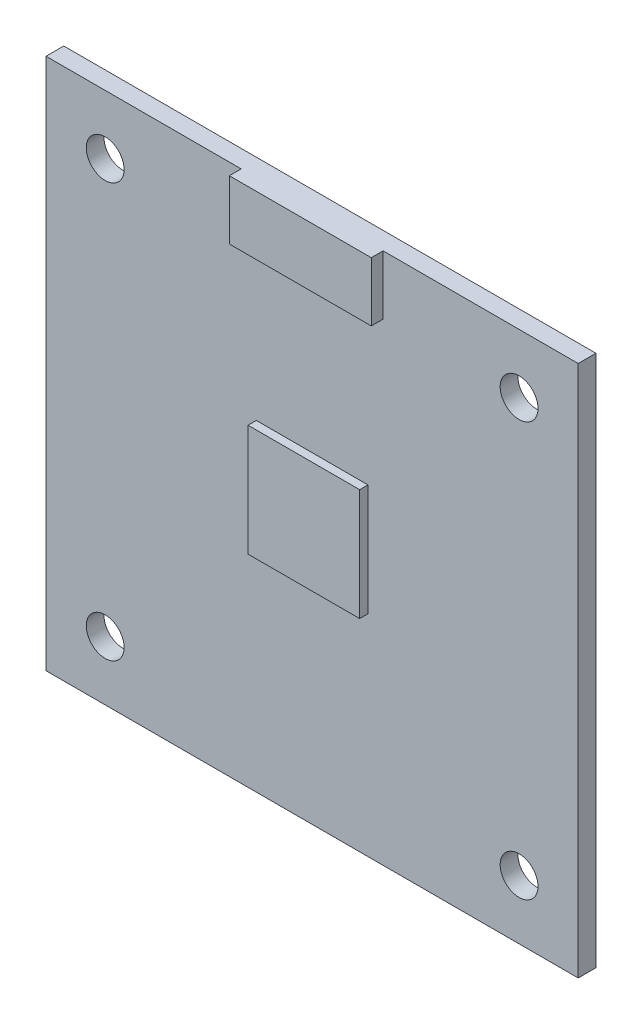
ISO-10303-21;
HEADER;
FILE_DESCRIPTION(('STEP AP214'),'2;1');
FILE_NAME('part.step','',(''),(''),'','','');
FILE_SCHEMA(('AUTOMOTIVE_DESIGN { 1 0 10303 214 1 1 1 1 }'));
ENDSEC;
DATA;
#1=APPLICATION_CONTEXT('core data for automotive mechanical design processes');
#2=APPLICATION_PROTOCOL_DEFINITION('international standard','automotive_design',2000,#1);
#3=PRODUCT_CONTEXT('',#1,'mechanical');
#4=PRODUCT('Part','Part','',(#3));
#5=PRODUCT_RELATED_PRODUCT_CATEGORY('part','',(#4));
#6=PRODUCT_DEFINITION_FORMATION('','',#4);
#7=PRODUCT_DEFINITION_CONTEXT('part definition',#1,'design');
#8=PRODUCT_DEFINITION('design','',#6,#7);
#9=PRODUCT_DEFINITION_SHAPE('','',#8);
#10=(LENGTH_UNIT() NAMED_UNIT(*) SI_UNIT(.MILLI.,.METRE.));
#11=(NAMED_UNIT(*) PLANE_ANGLE_UNIT() SI_UNIT($,.RADIAN.));
#12=(NAMED_UNIT(*) SI_UNIT($,.STERADIAN.) SOLID_ANGLE_UNIT());
#13=UNCERTAINTY_MEASURE_WITH_UNIT(LENGTH_MEASURE(1.E-05),#10,'distance_accuracy_value','');
#14=(GEOMETRIC_REPRESENTATION_CONTEXT(3) GLOBAL_UNCERTAINTY_ASSIGNED_CONTEXT((#13)) GLOBAL_UNIT_ASSIGNED_CONTEXT((#10,
#11,#12)) REPRESENTATION_CONTEXT('',''));
#15=CARTESIAN_POINT('',(0.,0.,0.));
#16=DIRECTION('',(0.,0.,1.));
#17=DIRECTION('',(1.,0.,0.));
#18=AXIS2_PLACEMENT_3D('',#15,#16,#17);
#19=CARTESIAN_POINT('',(0.,0.,2.2));
#20=DIRECTION('',(0.,0.,1.));
#21=DIRECTION('',(1.,0.,0.));
#22=AXIS2_PLACEMENT_3D('',#19,#20,#21);
#23=PLANE('',#22);
#24=DIRECTION('',(0.,1.,0.));
#25=VECTOR('',#24,1.);
#26=CARTESIAN_POINT('',(-4.72,4.72,2.2));
#27=LINE('',#26,#25);
#28=CARTESIAN_POINT('',(-4.72,4.72,2.2));
#29=VERTEX_POINT('',#28);
#30=CARTESIAN_POINT('',(-4.72,-4.72,2.2));
#31=VERTEX_POINT('',#30);
#32=EDGE_CURVE('E218',#29,#31,#27,.F.);
#33=ORIENTED_EDGE('',*,*,#32,.T.);
#34=DIRECTION('',(1.,0.,0.));
#35=VECTOR('',#34,1.);
#36=CARTESIAN_POINT('',(-4.72,-4.72,2.2));
#37=LINE('',#36,#35);
#38=CARTESIAN_POINT('',(4.72,-4.72,2.2));
#39=VERTEX_POINT('',#38);
#40=EDGE_CURVE('E122',#31,#39,#37,.T.);
#41=ORIENTED_EDGE('',*,*,#40,.T.);
#42=DIRECTION('',(0.,1.,0.));
#43=VECTOR('',#42,1.);
#44=CARTESIAN_POINT('',(4.72,4.72,2.2));
#45=LINE('',#44,#43);
#46=CARTESIAN_POINT('',(4.72,4.72,2.2));
#47=VERTEX_POINT('',#46);
#48=EDGE_CURVE('E104',#39,#47,#45,.T.);
#49=ORIENTED_EDGE('',*,*,#48,.T.);
#50=DIRECTION('',(1.,0.,0.));
#51=VECTOR('',#50,1.);
#52=CARTESIAN_POINT('',(-4.72,4.72,2.2));
#53=LINE('',#52,#51);
#54=EDGE_CURVE('E110',#47,#29,#53,.F.);
#55=ORIENTED_EDGE('',*,*,#54,.T.);
#56=EDGE_LOOP('',(#33,#41,#49,#55));
#57=FACE_BOUND('',#56,.T.);
#58=ADVANCED_FACE('F16',(#57),#23,.T.);
#59=CARTESIAN_POINT('',(-4.72,4.72,2.2));
#60=DIRECTION('',(0.,-1.,0.));
#61=DIRECTION('',(1.,0.,0.));
#62=AXIS2_PLACEMENT_3D('',#59,#60,#61);
#63=PLANE('',#62);
#64=DIRECTION('',(0.,0.,1.));
#65=VECTOR('',#64,1.);
#66=CARTESIAN_POINT('',(-4.72,4.72,2.2));
#67=LINE('',#66,#65);
#68=CARTESIAN_POINT('',(-4.72,4.72,1.5));
#69=VERTEX_POINT('',#68);
#70=EDGE_CURVE('E115',#69,#29,#67,.T.);
#71=ORIENTED_EDGE('',*,*,#70,.T.);
#72=ORIENTED_EDGE('',*,*,#54,.F.);
#73=DIRECTION('',(0.,0.,1.));
#74=VECTOR('',#73,1.);
#75=CARTESIAN_POINT('',(4.72,4.72,2.2));
#76=LINE('',#75,#74);
#77=CARTESIAN_POINT('',(4.72,4.72,1.5));
#78=VERTEX_POINT('',#77);
#79=EDGE_CURVE('E113',#47,#78,#76,.F.);
#80=ORIENTED_EDGE('',*,*,#79,.T.);
#81=DIRECTION('',(1.,0.,0.));
#82=VECTOR('',#81,1.);
#83=CARTESIAN_POINT('',(0.,4.72,1.5));
#84=LINE('',#83,#82);
#85=EDGE_CURVE('E195',#69,#78,#84,.T.);
#86=ORIENTED_EDGE('',*,*,#85,.F.);
#87=EDGE_LOOP('',(#71,#72,#80,#86));
#88=FACE_BOUND('',#87,.T.);
#89=ADVANCED_FACE('F111',(#88),#63,.F.);
#90=CARTESIAN_POINT('',(4.72,4.72,2.2));
#91=DIRECTION('',(-1.,0.,0.));
#92=DIRECTION('',(0.,0.,1.));
#93=AXIS2_PLACEMENT_3D('',#90,#91,#92);
#94=PLANE('',#93);
#95=ORIENTED_EDGE('',*,*,#79,.F.);
#96=ORIENTED_EDGE('',*,*,#48,.F.);
#97=DIRECTION('',(0.,0.,1.));
#98=VECTOR('',#97,1.);
#99=CARTESIAN_POINT('',(4.72,-4.72,2.2));
#100=LINE('',#99,#98);
#101=CARTESIAN_POINT('',(4.72,-4.72,1.5));
#102=VERTEX_POINT('',#101);
#103=EDGE_CURVE('E221',#39,#102,#100,.F.);
#104=ORIENTED_EDGE('',*,*,#103,.T.);
#105=DIRECTION('',(0.,1.,0.));
#106=VECTOR('',#105,1.);
#107=CARTESIAN_POINT('',(4.72,0.,1.5));
#108=LINE('',#107,#106);
#109=EDGE_CURVE('E121',#78,#102,#108,.F.);
#110=ORIENTED_EDGE('',*,*,#109,.F.);
#111=EDGE_LOOP('',(#95,#96,#104,#110));
#112=FACE_BOUND('',#111,.T.);
#113=ADVANCED_FACE('F120',(#112),#94,.F.);
#114=CARTESIAN_POINT('',(-4.72,-4.72,2.2));
#115=DIRECTION('',(0.,1.,0.));
#116=DIRECTION('',(0.,0.,1.));
#117=AXIS2_PLACEMENT_3D('',#114,#115,#116);
#118=PLANE('',#117);
#119=ORIENTED_EDGE('',*,*,#103,.F.);
#120=ORIENTED_EDGE('',*,*,#40,.F.);
#121=DIRECTION('',(0.,0.,1.));
#122=VECTOR('',#121,1.);
#123=CARTESIAN_POINT('',(-4.72,-4.72,2.2));
#124=LINE('',#123,#122);
#125=CARTESIAN_POINT('',(-4.72,-4.72,1.5));
#126=VERTEX_POINT('',#125);
#127=EDGE_CURVE('E215',#31,#126,#124,.F.);
#128=ORIENTED_EDGE('',*,*,#127,.T.);
#129=DIRECTION('',(1.,0.,0.));
#130=VECTOR('',#129,1.);
#131=CARTESIAN_POINT('',(0.,-4.72,1.5));
#132=LINE('',#131,#130);
#133=EDGE_CURVE('E192',#102,#126,#132,.F.);
#134=ORIENTED_EDGE('',*,*,#133,.F.);
#135=EDGE_LOOP('',(#119,#120,#128,#134));
#136=FACE_BOUND('',#135,.T.);
#137=ADVANCED_FACE('F224',(#136),#118,.F.);
#138=CARTESIAN_POINT('',(-4.72,4.72,2.2));
#139=DIRECTION('',(1.,0.,0.));
#140=DIRECTION('',(0.,1.,0.));
#141=AXIS2_PLACEMENT_3D('',#138,#139,#140);
#142=PLANE('',#141);
#143=ORIENTED_EDGE('',*,*,#127,.F.);
#144=ORIENTED_EDGE('',*,*,#32,.F.);
#145=ORIENTED_EDGE('',*,*,#70,.F.);
#146=DIRECTION('',(0.,1.,0.));
#147=VECTOR('',#146,1.);
#148=CARTESIAN_POINT('',(-4.72,0.,1.5));
#149=LINE('',#148,#147);
#150=EDGE_CURVE('E189',#126,#69,#149,.T.);
#151=ORIENTED_EDGE('',*,*,#150,.F.);
#152=EDGE_LOOP('',(#143,#144,#145,#151));
#153=FACE_BOUND('',#152,.T.);
#154=ADVANCED_FACE('F231',(#153),#142,.F.);
#155=CARTESIAN_POINT('',(-6.,17.5,2.5));
#156=DIRECTION('',(0.,1.,0.));
#157=DIRECTION('',(0.,0.,1.));
#158=AXIS2_PLACEMENT_3D('',#155,#156,#157);
#159=PLANE('',#158);
#160=DIRECTION('',(0.,0.,1.));
#161=VECTOR('',#160,1.);
#162=CARTESIAN_POINT('',(6.,17.5,2.5));
#163=LINE('',#162,#161);
#164=CARTESIAN_POINT('',(6.,17.5,1.5));
#165=VERTEX_POINT('',#164);
#166=CARTESIAN_POINT('',(6.,17.5,2.5));
#167=VERTEX_POINT('',#166);
#168=EDGE_CURVE('E207',#165,#167,#163,.T.);
#169=ORIENTED_EDGE('',*,*,#168,.T.);
#170=DIRECTION('',(1.,0.,0.));
#171=VECTOR('',#170,1.);
#172=CARTESIAN_POINT('',(0.,17.5,2.5));
#173=LINE('',#172,#171);
#174=CARTESIAN_POINT('',(-6.,17.5,2.5));
#175=VERTEX_POINT('',#174);
#176=EDGE_CURVE('E200',#175,#167,#173,.T.);
#177=ORIENTED_EDGE('',*,*,#176,.F.);
#178=DIRECTION('',(0.,0.,1.));
#179=VECTOR('',#178,1.);
#180=CARTESIAN_POINT('',(-6.,17.5,2.5));
#181=LINE('',#180,#179);
#182=CARTESIAN_POINT('',(-6.,17.5,1.5));
#183=VERTEX_POINT('',#182);
#184=EDGE_CURVE('E210',#175,#183,#181,.F.);
#185=ORIENTED_EDGE('',*,*,#184,.T.);
#186=DIRECTION('',(1.,0.,0.));
#187=VECTOR('',#186,1.);
#188=CARTESIAN_POINT('',(0.,17.5,1.5));
#189=LINE('',#188,#187);
#190=EDGE_CURVE('E187',#165,#183,#189,.F.);
#191=ORIENTED_EDGE('',*,*,#190,.F.);
#192=EDGE_LOOP('',(#169,#177,#185,#191));
#193=FACE_BOUND('',#192,.T.);
#194=ADVANCED_FACE('F233',(#193),#159,.F.);
#195=CARTESIAN_POINT('',(-6.,22.5,2.5));
#196=DIRECTION('',(1.,0.,0.));
#197=DIRECTION('',(0.,1.,0.));
#198=AXIS2_PLACEMENT_3D('',#195,#196,#197);
#199=PLANE('',#198);
#200=ORIENTED_EDGE('',*,*,#184,.F.);
#201=DIRECTION('',(0.,1.,0.));
#202=VECTOR('',#201,1.);
#203=CARTESIAN_POINT('',(-6.,0.,2.5));
#204=LINE('',#203,#202);
#205=CARTESIAN_POINT('',(-6.,22.5,2.5));
#206=VERTEX_POINT('',#205);
#207=EDGE_CURVE('E202',#206,#175,#204,.F.);
#208=ORIENTED_EDGE('',*,*,#207,.F.);
#209=DIRECTION('',(0.,0.,1.));
#210=VECTOR('',#209,1.);
#211=CARTESIAN_POINT('',(-6.,22.5,2.5));
#212=LINE('',#211,#210);
#213=CARTESIAN_POINT('',(-6.,22.5,1.5));
#214=VERTEX_POINT('',#213);
#215=EDGE_CURVE('E213',#214,#206,#212,.T.);
#216=ORIENTED_EDGE('',*,*,#215,.F.);
#217=DIRECTION('',(0.,1.,0.));
#218=VECTOR('',#217,1.);
#219=CARTESIAN_POINT('',(-6.,0.,1.5));
#220=LINE('',#219,#218);
#221=EDGE_CURVE('E184',#183,#214,#220,.T.);
#222=ORIENTED_EDGE('',*,*,#221,.F.);
#223=EDGE_LOOP('',(#200,#208,#216,#222));
#224=FACE_BOUND('',#223,.T.);
#225=ADVANCED_FACE('F240',(#224),#199,.F.);
#226=CARTESIAN_POINT('',(6.,22.5,2.5));
#227=DIRECTION('',(-1.,0.,0.));
#228=DIRECTION('',(0.,-1.,0.));
#229=AXIS2_PLACEMENT_3D('',#226,#227,#228);
#230=PLANE('',#229);
#231=DIRECTION('',(0.,0.,1.));
#232=VECTOR('',#231,1.);
#233=CARTESIAN_POINT('',(6.,22.5,2.5));
#234=LINE('',#233,#232);
#235=CARTESIAN_POINT('',(6.,22.5,2.5));
#236=VERTEX_POINT('',#235);
#237=CARTESIAN_POINT('',(5.99999999999999,22.5,1.5));
#238=VERTEX_POINT('',#237);
#239=EDGE_CURVE('E205',#236,#238,#234,.F.);
#240=ORIENTED_EDGE('',*,*,#239,.F.);
#241=DIRECTION('',(0.,1.,0.));
#242=VECTOR('',#241,1.);
#243=CARTESIAN_POINT('',(6.,0.,2.5));
#244=LINE('',#243,#242);
#245=EDGE_CURVE('E197',#167,#236,#244,.T.);
#246=ORIENTED_EDGE('',*,*,#245,.F.);
#247=ORIENTED_EDGE('',*,*,#168,.F.);
#248=DIRECTION('',(0.,1.,0.));
#249=VECTOR('',#248,1.);
#250=CARTESIAN_POINT('',(5.99999999999999,0.,1.5));
#251=LINE('',#250,#249);
#252=EDGE_CURVE('E181',#238,#165,#251,.F.);
#253=ORIENTED_EDGE('',*,*,#252,.F.);
#254=EDGE_LOOP('',(#240,#246,#247,#253));
#255=FACE_BOUND('',#254,.T.);
#256=ADVANCED_FACE('F289',(#255),#230,.F.);
#257=CARTESIAN_POINT('',(0.,0.,2.5));
#258=DIRECTION('',(0.,0.,1.));
#259=DIRECTION('',(1.,0.,0.));
#260=AXIS2_PLACEMENT_3D('',#257,#258,#259);
#261=PLANE('',#260);
#262=ORIENTED_EDGE('',*,*,#245,.T.);
#263=DIRECTION('',(1.,0.,0.));
#264=VECTOR('',#263,1.);
#265=CARTESIAN_POINT('',(-22.5,22.5,2.5));
#266=LINE('',#265,#264);
#267=EDGE_CURVE('E175',#236,#206,#266,.F.);
#268=ORIENTED_EDGE('',*,*,#267,.T.);
#269=ORIENTED_EDGE('',*,*,#207,.T.);
#270=ORIENTED_EDGE('',*,*,#176,.T.);
#271=EDGE_LOOP('',(#262,#268,#269,#270));
#272=FACE_BOUND('',#271,.T.);
#273=ADVANCED_FACE('F285',(#272),#261,.T.);
#274=CARTESIAN_POINT('',(0.,0.,1.5));
#275=DIRECTION('',(0.,0.,1.));
#276=DIRECTION('',(1.,0.,0.));
#277=AXIS2_PLACEMENT_3D('',#274,#275,#276);
#278=PLANE('',#277);
#279=DIRECTION('',(1.,0.,0.));
#280=VECTOR('',#279,1.);
#281=CARTESIAN_POINT('',(-22.5,22.5,1.5));
#282=LINE('',#281,#280);
#283=CARTESIAN_POINT('',(22.5,22.5,1.5));
#284=VERTEX_POINT('',#283);
#285=EDGE_CURVE('E178',#284,#238,#282,.F.);
#286=ORIENTED_EDGE('',*,*,#285,.T.);
#287=ORIENTED_EDGE('',*,*,#252,.T.);
#288=ORIENTED_EDGE('',*,*,#190,.T.);
#289=ORIENTED_EDGE('',*,*,#221,.T.);
#290=DIRECTION('',(1.,0.,0.));
#291=VECTOR('',#290,1.);
#292=CARTESIAN_POINT('',(-22.5,22.5,1.5));
#293=LINE('',#292,#291);
#294=CARTESIAN_POINT('',(-22.5,22.5,1.5));
#295=VERTEX_POINT('',#294);
#296=EDGE_CURVE('E173',#214,#295,#293,.F.);
#297=ORIENTED_EDGE('',*,*,#296,.T.);
#298=DIRECTION('',(0.,1.,0.));
#299=VECTOR('',#298,1.);
#300=CARTESIAN_POINT('',(-22.5,22.5,1.5));
#301=LINE('',#300,#299);
#302=CARTESIAN_POINT('',(-22.5,-22.5,1.5));
#303=VERTEX_POINT('',#302);
#304=EDGE_CURVE('E168',#295,#303,#301,.F.);
#305=ORIENTED_EDGE('',*,*,#304,.T.);
#306=DIRECTION('',(1.,0.,0.));
#307=VECTOR('',#306,1.);
#308=CARTESIAN_POINT('',(-22.5,-22.5,1.5));
#309=LINE('',#308,#307);
#310=CARTESIAN_POINT('',(22.5,-22.5,1.5));
#311=VERTEX_POINT('',#310);
#312=EDGE_CURVE('E163',#303,#311,#309,.T.);
#313=ORIENTED_EDGE('',*,*,#312,.T.);
#314=DIRECTION('',(0.,-1.,0.));
#315=VECTOR('',#314,1.);
#316=CARTESIAN_POINT('',(22.5,22.5,1.5));
#317=LINE('',#316,#315);
#318=EDGE_CURVE('E152',#311,#284,#317,.F.);
#319=ORIENTED_EDGE('',*,*,#318,.T.);
#320=EDGE_LOOP('',(#286,#287,#288,#289,#297,#305,#313,#319));
#321=FACE_BOUND('',#320,.T.);
#322=ORIENTED_EDGE('',*,*,#133,.T.);
#323=ORIENTED_EDGE('',*,*,#150,.T.);
#324=ORIENTED_EDGE('',*,*,#85,.T.);
#325=ORIENTED_EDGE('',*,*,#109,.T.);
#326=EDGE_LOOP('',(#322,#323,#324,#325));
#327=FACE_BOUND('',#326,.T.);
#328=CARTESIAN_POINT('',(-17.5,-17.5,1.5));
#329=DIRECTION('',(0.,0.,-1.));
#330=DIRECTION('',(-1.,0.,0.));
#331=AXIS2_PLACEMENT_3D('',#328,#329,#330);
#332=CIRCLE('',#331,1.6);
#333=CARTESIAN_POINT('',(-19.1,-17.5,1.5));
#334=VERTEX_POINT('',#333);
#335=EDGE_CURVE('E137',#334,#334,#332,.T.);
#336=ORIENTED_EDGE('',*,*,#335,.T.);
#337=EDGE_LOOP('',(#336));
#338=FACE_BOUND('',#337,.T.);
#339=CARTESIAN_POINT('',(17.5,17.5,1.5));
#340=DIRECTION('',(0.,0.,-1.));
#341=DIRECTION('',(-1.,0.,0.));
#342=AXIS2_PLACEMENT_3D('',#339,#340,#341);
#343=CIRCLE('',#342,1.6);
#344=CARTESIAN_POINT('',(15.9,17.5,1.5));
#345=VERTEX_POINT('',#344);
#346=EDGE_CURVE('E143',#345,#345,#343,.T.);
#347=ORIENTED_EDGE('',*,*,#346,.T.);
#348=EDGE_LOOP('',(#347));
#349=FACE_BOUND('',#348,.T.);
#350=CARTESIAN_POINT('',(-17.5,17.5,1.5));
#351=DIRECTION('',(0.,0.,-1.));
#352=DIRECTION('',(-1.,0.,0.));
#353=AXIS2_PLACEMENT_3D('',#350,#351,#352);
#354=CIRCLE('',#353,1.6);
#355=CARTESIAN_POINT('',(-19.1,17.5,1.5));
#356=VERTEX_POINT('',#355);
#357=EDGE_CURVE('E19',#356,#356,#354,.T.);
#358=ORIENTED_EDGE('',*,*,#357,.T.);
#359=EDGE_LOOP('',(#358));
#360=FACE_BOUND('',#359,.T.);
#361=CARTESIAN_POINT('',(17.5,-17.5,1.5));
#362=DIRECTION('',(0.,0.,-1.));
#363=DIRECTION('',(-1.,0.,0.));
#364=AXIS2_PLACEMENT_3D('',#361,#362,#363);
#365=CIRCLE('',#364,1.6);
#366=CARTESIAN_POINT('',(15.9,-17.5,1.5));
#367=VERTEX_POINT('',#366);
#368=EDGE_CURVE('E141',#367,#367,#365,.T.);
#369=ORIENTED_EDGE('',*,*,#368,.T.);
#370=EDGE_LOOP('',(#369));
#371=FACE_BOUND('',#370,.T.);
#372=ADVANCED_FACE('F228',(#321,#327,#338,#349,#360,#371),#278,.T.);
#373=CARTESIAN_POINT('',(-22.5,22.5,1.5));
#374=DIRECTION('',(0.,-1.,0.));
#375=DIRECTION('',(0.,0.,-1.));
#376=AXIS2_PLACEMENT_3D('',#373,#374,#375);
#377=PLANE('',#376);
#378=DIRECTION('',(0.,0.,1.));
#379=VECTOR('',#378,1.);
#380=CARTESIAN_POINT('',(-22.5,22.5,1.5));
#381=LINE('',#380,#379);
#382=CARTESIAN_POINT('',(-22.5,22.5,0.));
#383=VERTEX_POINT('',#382);
#384=EDGE_CURVE('E170',#383,#295,#381,.T.);
#385=ORIENTED_EDGE('',*,*,#384,.T.);
#386=ORIENTED_EDGE('',*,*,#296,.F.);
#387=ORIENTED_EDGE('',*,*,#215,.T.);
#388=ORIENTED_EDGE('',*,*,#267,.F.);
#389=ORIENTED_EDGE('',*,*,#239,.T.);
#390=ORIENTED_EDGE('',*,*,#285,.F.);
#391=DIRECTION('',(0.,0.,1.));
#392=VECTOR('',#391,1.);
#393=CARTESIAN_POINT('',(22.5,22.5,1.5));
#394=LINE('',#393,#392);
#395=CARTESIAN_POINT('',(22.5,22.5,0.));
#396=VERTEX_POINT('',#395);
#397=EDGE_CURVE('E148',#284,#396,#394,.F.);
#398=ORIENTED_EDGE('',*,*,#397,.T.);
#399=DIRECTION('',(1.,0.,0.));
#400=VECTOR('',#399,1.);
#401=CARTESIAN_POINT('',(0.,22.5,0.));
#402=LINE('',#401,#400);
#403=EDGE_CURVE('E140',#396,#383,#402,.F.);
#404=ORIENTED_EDGE('',*,*,#403,.T.);
#405=EDGE_LOOP('',(#385,#386,#387,#388,#389,#390,#398,#404));
#406=FACE_BOUND('',#405,.T.);
#407=ADVANCED_FACE('F279',(#406),#377,.F.);
#408=CARTESIAN_POINT('',(-22.5,22.5,1.5));
#409=DIRECTION('',(1.,0.,0.));
#410=DIRECTION('',(0.,1.,0.));
#411=AXIS2_PLACEMENT_3D('',#408,#409,#410);
#412=PLANE('',#411);
#413=DIRECTION('',(0.,0.,1.));
#414=VECTOR('',#413,1.);
#415=CARTESIAN_POINT('',(-22.5,-22.5,1.5));
#416=LINE('',#415,#414);
#417=CARTESIAN_POINT('',(-22.5,-22.5,0.));
#418=VERTEX_POINT('',#417);
#419=EDGE_CURVE('E165',#418,#303,#416,.T.);
#420=ORIENTED_EDGE('',*,*,#419,.T.);
#421=ORIENTED_EDGE('',*,*,#304,.F.);
#422=ORIENTED_EDGE('',*,*,#384,.F.);
#423=DIRECTION('',(0.,1.,0.));
#424=VECTOR('',#423,1.);
#425=CARTESIAN_POINT('',(-22.5,0.,0.));
#426=LINE('',#425,#424);
#427=EDGE_CURVE('E312',#383,#418,#426,.F.);
#428=ORIENTED_EDGE('',*,*,#427,.T.);
#429=EDGE_LOOP('',(#420,#421,#422,#428));
#430=FACE_BOUND('',#429,.T.);
#431=ADVANCED_FACE('F275',(#430),#412,.F.);
#432=CARTESIAN_POINT('',(-22.5,-22.5,1.5));
#433=DIRECTION('',(0.,1.,0.));
#434=DIRECTION('',(0.,0.,1.));
#435=AXIS2_PLACEMENT_3D('',#432,#433,#434);
#436=PLANE('',#435);
#437=DIRECTION('',(0.,0.,1.));
#438=VECTOR('',#437,1.);
#439=CARTESIAN_POINT('',(22.5,-22.5,1.5));
#440=LINE('',#439,#438);
#441=CARTESIAN_POINT('',(22.5,-22.5,0.));
#442=VERTEX_POINT('',#441);
#443=EDGE_CURVE('E34',#442,#311,#440,.T.);
#444=ORIENTED_EDGE('',*,*,#443,.T.);
#445=ORIENTED_EDGE('',*,*,#312,.F.);
#446=ORIENTED_EDGE('',*,*,#419,.F.);
#447=DIRECTION('',(1.,0.,0.));
#448=VECTOR('',#447,1.);
#449=CARTESIAN_POINT('',(0.,-22.5,0.));
#450=LINE('',#449,#448);
#451=EDGE_CURVE('E310',#418,#442,#450,.T.);
#452=ORIENTED_EDGE('',*,*,#451,.T.);
#453=EDGE_LOOP('',(#444,#445,#446,#452));
#454=FACE_BOUND('',#453,.T.);
#455=ADVANCED_FACE('F272',(#454),#436,.F.);
#456=CARTESIAN_POINT('',(22.5,22.5,1.5));
#457=DIRECTION('',(-1.,0.,0.));
#458=DIRECTION('',(0.,-1.,0.));
#459=AXIS2_PLACEMENT_3D('',#456,#457,#458);
#460=PLANE('',#459);
#461=ORIENTED_EDGE('',*,*,#397,.F.);
#462=ORIENTED_EDGE('',*,*,#318,.F.);
#463=ORIENTED_EDGE('',*,*,#443,.F.);
#464=DIRECTION('',(0.,1.,0.));
#465=VECTOR('',#464,1.);
#466=CARTESIAN_POINT('',(22.5,0.,0.));
#467=LINE('',#466,#465);
#468=EDGE_CURVE('E136',#442,#396,#467,.T.);
#469=ORIENTED_EDGE('',*,*,#468,.T.);
#470=EDGE_LOOP('',(#461,#462,#463,#469));
#471=FACE_BOUND('',#470,.T.);
#472=ADVANCED_FACE('F268',(#471),#460,.F.);
#473=CARTESIAN_POINT('',(-17.5,17.5,1.5));
#474=DIRECTION('',(0.,0.,-1.));
#475=DIRECTION('',(-1.,0.,0.));
#476=AXIS2_PLACEMENT_3D('',#473,#474,#475);
#477=CYLINDRICAL_SURFACE('',#476,1.6);
#478=CARTESIAN_POINT('',(-17.5,17.5,0.));
#479=DIRECTION('',(0.,0.,-1.));
#480=DIRECTION('',(-1.,0.,0.));
#481=AXIS2_PLACEMENT_3D('',#478,#479,#480);
#482=CIRCLE('',#481,1.6);
#483=CARTESIAN_POINT('',(-19.1,17.5,0.));
#484=VERTEX_POINT('',#483);
#485=EDGE_CURVE('E133',#484,#484,#482,.T.);
#486=ORIENTED_EDGE('',*,*,#485,.T.);
#487=EDGE_LOOP('',(#486));
#488=FACE_BOUND('',#487,.T.);
#489=ORIENTED_EDGE('',*,*,#357,.F.);
#490=EDGE_LOOP('',(#489));
#491=FACE_BOUND('',#490,.T.);
#492=ADVANCED_FACE('F264',(#488,#491),#477,.F.);
#493=CARTESIAN_POINT('',(17.5,17.5,1.5));
#494=DIRECTION('',(0.,0.,-1.));
#495=DIRECTION('',(-1.,0.,0.));
#496=AXIS2_PLACEMENT_3D('',#493,#494,#495);
#497=CYLINDRICAL_SURFACE('',#496,1.6);
#498=CARTESIAN_POINT('',(17.5,17.5,0.));
#499=DIRECTION('',(0.,0.,-1.));
#500=DIRECTION('',(-1.,0.,0.));
#501=AXIS2_PLACEMENT_3D('',#498,#499,#500);
#502=CIRCLE('',#501,1.6);
#503=CARTESIAN_POINT('',(15.9,17.5,0.));
#504=VERTEX_POINT('',#503);
#505=EDGE_CURVE('E130',#504,#504,#502,.T.);
#506=ORIENTED_EDGE('',*,*,#505,.T.);
#507=EDGE_LOOP('',(#506));
#508=FACE_BOUND('',#507,.T.);
#509=ORIENTED_EDGE('',*,*,#346,.F.);
#510=EDGE_LOOP('',(#509));
#511=FACE_BOUND('',#510,.T.);
#512=ADVANCED_FACE('F260',(#508,#511),#497,.F.);
#513=CARTESIAN_POINT('',(17.5,-17.5,1.5));
#514=DIRECTION('',(0.,0.,-1.));
#515=DIRECTION('',(-1.,0.,0.));
#516=AXIS2_PLACEMENT_3D('',#513,#514,#515);
#517=CYLINDRICAL_SURFACE('',#516,1.6);
#518=CARTESIAN_POINT('',(17.5,-17.5,0.));
#519=DIRECTION('',(0.,0.,-1.));
#520=DIRECTION('',(-1.,0.,0.));
#521=AXIS2_PLACEMENT_3D('',#518,#519,#520);
#522=CIRCLE('',#521,1.6);
#523=CARTESIAN_POINT('',(15.9,-17.5,0.));
#524=VERTEX_POINT('',#523);
#525=EDGE_CURVE('E25',#524,#524,#522,.T.);
#526=ORIENTED_EDGE('',*,*,#525,.T.);
#527=EDGE_LOOP('',(#526));
#528=FACE_BOUND('',#527,.T.);
#529=ORIENTED_EDGE('',*,*,#368,.F.);
#530=EDGE_LOOP('',(#529));
#531=FACE_BOUND('',#530,.T.);
#532=ADVANCED_FACE('F252',(#528,#531),#517,.F.);
#533=CARTESIAN_POINT('',(-17.5,-17.5,1.5));
#534=DIRECTION('',(0.,0.,-1.));
#535=DIRECTION('',(-1.,0.,0.));
#536=AXIS2_PLACEMENT_3D('',#533,#534,#535);
#537=CYLINDRICAL_SURFACE('',#536,1.6);
#538=CARTESIAN_POINT('',(-17.5,-17.5,0.));
#539=DIRECTION('',(0.,0.,-1.));
#540=DIRECTION('',(-1.,0.,0.));
#541=AXIS2_PLACEMENT_3D('',#538,#539,#540);
#542=CIRCLE('',#541,1.6);
#543=CARTESIAN_POINT('',(-19.1,-17.5,0.));
#544=VERTEX_POINT('',#543);
#545=EDGE_CURVE('E11',#544,#544,#542,.T.);
#546=ORIENTED_EDGE('',*,*,#545,.T.);
#547=EDGE_LOOP('',(#546));
#548=FACE_BOUND('',#547,.T.);
#549=ORIENTED_EDGE('',*,*,#335,.F.);
#550=EDGE_LOOP('',(#549));
#551=FACE_BOUND('',#550,.T.);
#552=ADVANCED_FACE('F246',(#548,#551),#537,.F.);
#553=CARTESIAN_POINT('',(0.,0.,0.));
#554=DIRECTION('',(0.,0.,1.));
#555=DIRECTION('',(1.,0.,0.));
#556=AXIS2_PLACEMENT_3D('',#553,#554,#555);
#557=PLANE('',#556);
#558=ORIENTED_EDGE('',*,*,#545,.F.);
#559=EDGE_LOOP('',(#558));
#560=FACE_BOUND('',#559,.T.);
#561=ORIENTED_EDGE('',*,*,#525,.F.);
#562=EDGE_LOOP('',(#561));
#563=FACE_BOUND('',#562,.T.);
#564=ORIENTED_EDGE('',*,*,#505,.F.);
#565=EDGE_LOOP('',(#564));
#566=FACE_BOUND('',#565,.T.);
#567=ORIENTED_EDGE('',*,*,#485,.F.);
#568=EDGE_LOOP('',(#567));
#569=FACE_BOUND('',#568,.T.);
#570=ORIENTED_EDGE('',*,*,#451,.F.);
#571=ORIENTED_EDGE('',*,*,#427,.F.);
#572=ORIENTED_EDGE('',*,*,#403,.F.);
#573=ORIENTED_EDGE('',*,*,#468,.F.);
#574=EDGE_LOOP('',(#570,#571,#572,#573));
#575=FACE_BOUND('',#574,.T.);
#576=ADVANCED_FACE('F244',(#560,#563,#566,#569,#575),#557,.F.);
#577=CLOSED_SHELL('',(#58,#89,#113,#137,#154,#194,#225,#256,#273,#372,#407,#431,#455,#472,#492,
#512,#532,#552,#576));
#578=MANIFOLD_SOLID_BREP('B1',#577);
#579=ADVANCED_BREP_SHAPE_REPRESENTATION('',(#18,#578),#14);
#580=SHAPE_DEFINITION_REPRESENTATION(#9,#579);
ENDSEC;
END-ISO-10303-21;
